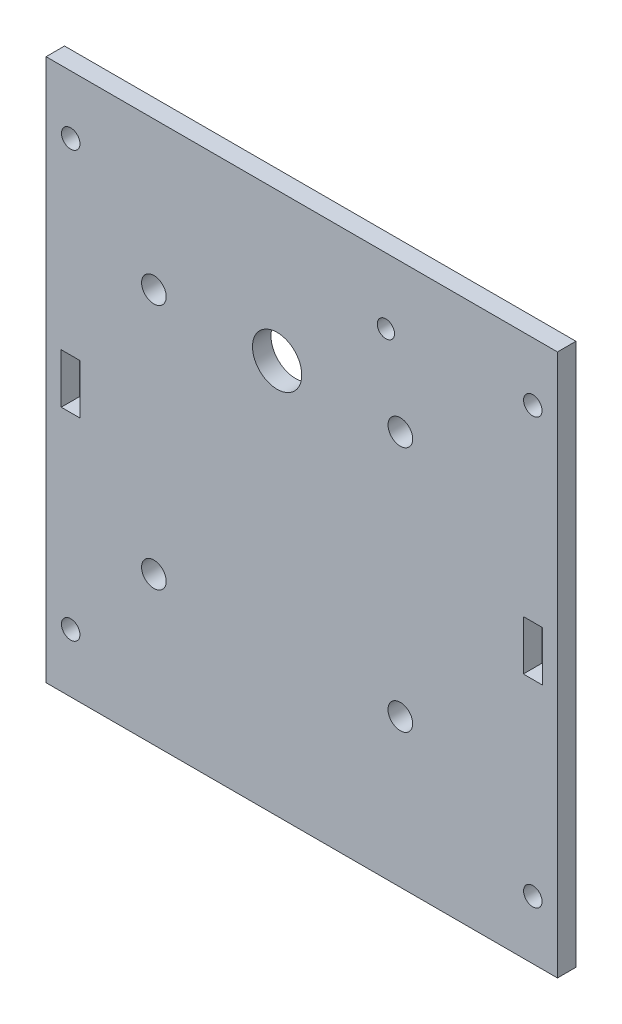
ISO-10303-21;
HEADER;
FILE_DESCRIPTION(('STEP AP214'),'2;1');
FILE_NAME('part.step','',(''),(''),'','','');
FILE_SCHEMA(('AUTOMOTIVE_DESIGN { 1 0 10303 214 1 1 1 1 }'));
ENDSEC;
DATA;
#1=APPLICATION_CONTEXT('core data for automotive mechanical design processes');
#2=APPLICATION_PROTOCOL_DEFINITION('international standard','automotive_design',2000,#1);
#3=PRODUCT_CONTEXT('',#1,'mechanical');
#4=PRODUCT('Part','Part','',(#3));
#5=PRODUCT_RELATED_PRODUCT_CATEGORY('part','',(#4));
#6=PRODUCT_DEFINITION_FORMATION('','',#4);
#7=PRODUCT_DEFINITION_CONTEXT('part definition',#1,'design');
#8=PRODUCT_DEFINITION('design','',#6,#7);
#9=PRODUCT_DEFINITION_SHAPE('','',#8);
#10=(LENGTH_UNIT() NAMED_UNIT(*) SI_UNIT(.MILLI.,.METRE.));
#11=(NAMED_UNIT(*) PLANE_ANGLE_UNIT() SI_UNIT($,.RADIAN.));
#12=(NAMED_UNIT(*) SI_UNIT($,.STERADIAN.) SOLID_ANGLE_UNIT());
#13=UNCERTAINTY_MEASURE_WITH_UNIT(LENGTH_MEASURE(1.E-05),#10,'distance_accuracy_value','');
#14=(GEOMETRIC_REPRESENTATION_CONTEXT(3) GLOBAL_UNCERTAINTY_ASSIGNED_CONTEXT((#13)) GLOBAL_UNIT_ASSIGNED_CONTEXT((#10,
#11,#12)) REPRESENTATION_CONTEXT('',''));
#15=CARTESIAN_POINT('',(0.,0.,0.));
#16=DIRECTION('',(0.,0.,1.));
#17=DIRECTION('',(1.,0.,0.));
#18=AXIS2_PLACEMENT_3D('',#15,#16,#17);
#19=CARTESIAN_POINT('',(0.,0.,3.));
#20=DIRECTION('',(0.,0.,1.));
#21=DIRECTION('',(1.,0.,0.));
#22=AXIS2_PLACEMENT_3D('',#19,#20,#21);
#23=PLANE('',#22);
#24=CARTESIAN_POINT('',(-5.65315315315312,7.11711711711726,3.));
#25=DIRECTION('',(0.,0.,1.));
#26=DIRECTION('',(1.,0.,0.));
#27=AXIS2_PLACEMENT_3D('',#24,#25,#26);
#28=CIRCLE('',#27,1.99999999999964);
#29=CARTESIAN_POINT('',(-3.65315315315347,7.11711711711726,3.));
#30=VERTEX_POINT('',#29);
#31=EDGE_CURVE('E185',#30,#30,#28,.T.);
#32=ORIENTED_EDGE('',*,*,#31,.F.);
#33=EDGE_LOOP('',(#32));
#34=FACE_BOUND('',#33,.T.);
#35=CARTESIAN_POINT('',(-45.6531531531531,-32.8828828828828,3.));
#36=DIRECTION('',(0.,0.,1.));
#37=DIRECTION('',(1.,0.,0.));
#38=AXIS2_PLACEMENT_3D('',#35,#36,#37);
#39=CIRCLE('',#38,2.00000000000004);
#40=CARTESIAN_POINT('',(-43.6531531531531,-32.8828828828828,3.));
#41=VERTEX_POINT('',#40);
#42=EDGE_CURVE('E201',#41,#41,#39,.T.);
#43=ORIENTED_EDGE('',*,*,#42,.F.);
#44=EDGE_LOOP('',(#43));
#45=FACE_BOUND('',#44,.T.);
#46=CARTESIAN_POINT('',(-5.65315315315312,-32.8828828828828,3.));
#47=DIRECTION('',(0.,0.,1.));
#48=DIRECTION('',(1.,0.,0.));
#49=AXIS2_PLACEMENT_3D('',#46,#47,#48);
#50=CIRCLE('',#49,1.99999999999992);
#51=CARTESIAN_POINT('',(-3.6531531531532,-32.8828828828828,3.));
#52=VERTEX_POINT('',#51);
#53=EDGE_CURVE('E217',#52,#52,#50,.T.);
#54=ORIENTED_EDGE('',*,*,#53,.F.);
#55=EDGE_LOOP('',(#54));
#56=FACE_BOUND('',#55,.T.);
#57=CARTESIAN_POINT('',(-59.1531531531532,-47.3828828828829,3.));
#58=DIRECTION('',(0.,0.,1.));
#59=DIRECTION('',(1.,0.,0.));
#60=AXIS2_PLACEMENT_3D('',#57,#58,#59);
#61=CIRCLE('',#60,1.5);
#62=CARTESIAN_POINT('',(-57.6531531531532,-47.3828828828829,3.));
#63=VERTEX_POINT('',#62);
#64=EDGE_CURVE('E233',#63,#63,#61,.T.);
#65=ORIENTED_EDGE('',*,*,#64,.F.);
#66=EDGE_LOOP('',(#65));
#67=FACE_BOUND('',#66,.T.);
#68=CARTESIAN_POINT('',(-59.1531531531532,21.6171171171171,3.));
#69=DIRECTION('',(0.,0.,1.));
#70=DIRECTION('',(1.,0.,0.));
#71=AXIS2_PLACEMENT_3D('',#68,#69,#70);
#72=CIRCLE('',#71,1.5);
#73=CARTESIAN_POINT('',(-57.6531531531532,21.6171171171171,3.));
#74=VERTEX_POINT('',#73);
#75=EDGE_CURVE('E249',#74,#74,#72,.T.);
#76=ORIENTED_EDGE('',*,*,#75,.F.);
#77=EDGE_LOOP('',(#76));
#78=FACE_BOUND('',#77,.T.);
#79=DIRECTION('',(-1.,0.,0.));
#80=VECTOR('',#79,1.);
#81=CARTESIAN_POINT('',(-63.1531531531532,31.1171171171171,3.));
#82=LINE('',#81,#80);
#83=CARTESIAN_POINT('',(19.8468468468468,31.1171171171171,3.));
#84=VERTEX_POINT('',#83);
#85=CARTESIAN_POINT('',(-63.1531531531532,31.1171171171171,3.));
#86=VERTEX_POINT('',#85);
#87=EDGE_CURVE('E300',#84,#86,#82,.T.);
#88=ORIENTED_EDGE('',*,*,#87,.T.);
#89=DIRECTION('',(0.,-1.,0.));
#90=VECTOR('',#89,1.);
#91=CARTESIAN_POINT('',(-63.1531531531532,31.1171171171171,3.));
#92=LINE('',#91,#90);
#93=CARTESIAN_POINT('',(-63.1531531531532,-56.8828828828829,3.));
#94=VERTEX_POINT('',#93);
#95=EDGE_CURVE('E304',#86,#94,#92,.T.);
#96=ORIENTED_EDGE('',*,*,#95,.T.);
#97=DIRECTION('',(1.,0.,0.));
#98=VECTOR('',#97,1.);
#99=CARTESIAN_POINT('',(19.8468468468468,-56.8828828828829,3.));
#100=LINE('',#99,#98);
#101=CARTESIAN_POINT('',(19.8468468468468,-56.8828828828829,3.));
#102=VERTEX_POINT('',#101);
#103=EDGE_CURVE('E308',#94,#102,#100,.T.);
#104=ORIENTED_EDGE('',*,*,#103,.T.);
#105=DIRECTION('',(0.,1.,0.));
#106=VECTOR('',#105,1.);
#107=CARTESIAN_POINT('',(19.8468468468468,-56.8828828828829,3.));
#108=LINE('',#107,#106);
#109=EDGE_CURVE('E311',#102,#84,#108,.T.);
#110=ORIENTED_EDGE('',*,*,#109,.T.);
#111=EDGE_LOOP('',(#88,#96,#104,#110));
#112=FACE_BOUND('',#111,.T.);
#113=DIRECTION('',(-1.,0.,0.));
#114=VECTOR('',#113,1.);
#115=CARTESIAN_POINT('',(-60.6931531531532,-8.84288288288288,3.));
#116=LINE('',#115,#114);
#117=CARTESIAN_POINT('',(-57.6131531531532,-8.84288288288288,3.));
#118=VERTEX_POINT('',#117);
#119=CARTESIAN_POINT('',(-60.6931531531532,-8.84288288288288,3.));
#120=VERTEX_POINT('',#119);
#121=EDGE_CURVE('E260',#118,#120,#116,.T.);
#122=ORIENTED_EDGE('',*,*,#121,.F.);
#123=DIRECTION('',(0.,1.,0.));
#124=VECTOR('',#123,1.);
#125=CARTESIAN_POINT('',(-57.6131531531532,-8.84288288288288,3.));
#126=LINE('',#125,#124);
#127=CARTESIAN_POINT('',(-57.6131531531532,-16.9228828828829,3.));
#128=VERTEX_POINT('',#127);
#129=EDGE_CURVE('E257',#128,#118,#126,.T.);
#130=ORIENTED_EDGE('',*,*,#129,.F.);
#131=DIRECTION('',(1.,0.,0.));
#132=VECTOR('',#131,1.);
#133=CARTESIAN_POINT('',(-60.6931531531532,-16.9228828828829,3.));
#134=LINE('',#133,#132);
#135=CARTESIAN_POINT('',(-60.6931531531532,-16.9228828828829,3.));
#136=VERTEX_POINT('',#135);
#137=EDGE_CURVE('E268',#136,#128,#134,.T.);
#138=ORIENTED_EDGE('',*,*,#137,.F.);
#139=DIRECTION('',(0.,-1.,0.));
#140=VECTOR('',#139,1.);
#141=CARTESIAN_POINT('',(-60.6931531531532,-8.84288288288288,3.));
#142=LINE('',#141,#140);
#143=EDGE_CURVE('E264',#120,#136,#142,.T.);
#144=ORIENTED_EDGE('',*,*,#143,.F.);
#145=EDGE_LOOP('',(#122,#130,#138,#144));
#146=FACE_BOUND('',#145,.T.);
#147=CARTESIAN_POINT('',(15.8468468468468,21.6171171171171,3.));
#148=DIRECTION('',(0.,0.,1.));
#149=DIRECTION('',(1.,0.,0.));
#150=AXIS2_PLACEMENT_3D('',#147,#148,#149);
#151=CIRCLE('',#150,1.5);
#152=CARTESIAN_POINT('',(17.3468468468468,21.6171171171171,3.));
#153=VERTEX_POINT('',#152);
#154=EDGE_CURVE('E241',#153,#153,#151,.T.);
#155=ORIENTED_EDGE('',*,*,#154,.F.);
#156=EDGE_LOOP('',(#155));
#157=FACE_BOUND('',#156,.T.);
#158=CARTESIAN_POINT('',(15.8468468468468,-47.3828828828829,3.));
#159=DIRECTION('',(0.,0.,1.));
#160=DIRECTION('',(1.,0.,0.));
#161=AXIS2_PLACEMENT_3D('',#158,#159,#160);
#162=CIRCLE('',#161,1.5);
#163=CARTESIAN_POINT('',(17.3468468468468,-47.3828828828829,3.));
#164=VERTEX_POINT('',#163);
#165=EDGE_CURVE('E225',#164,#164,#162,.T.);
#166=ORIENTED_EDGE('',*,*,#165,.F.);
#167=EDGE_LOOP('',(#166));
#168=FACE_BOUND('',#167,.T.);
#169=CARTESIAN_POINT('',(-25.653153153153,7.11711711711709,3.));
#170=DIRECTION('',(0.,0.,1.));
#171=DIRECTION('',(1.,0.,0.));
#172=AXIS2_PLACEMENT_3D('',#169,#170,#171);
#173=CIRCLE('',#172,4.);
#174=CARTESIAN_POINT('',(-21.653153153153,7.11711711711709,3.));
#175=VERTEX_POINT('',#174);
#176=EDGE_CURVE('E209',#175,#175,#173,.T.);
#177=ORIENTED_EDGE('',*,*,#176,.F.);
#178=EDGE_LOOP('',(#177));
#179=FACE_BOUND('',#178,.T.);
#180=CARTESIAN_POINT('',(-45.6531531531531,7.11711711711726,3.));
#181=DIRECTION('',(0.,0.,1.));
#182=DIRECTION('',(1.,0.,0.));
#183=AXIS2_PLACEMENT_3D('',#180,#181,#182);
#184=CIRCLE('',#183,1.99999999999992);
#185=CARTESIAN_POINT('',(-43.6531531531532,7.11711711711726,3.));
#186=VERTEX_POINT('',#185);
#187=EDGE_CURVE('E193',#186,#186,#184,.T.);
#188=ORIENTED_EDGE('',*,*,#187,.F.);
#189=EDGE_LOOP('',(#188));
#190=FACE_BOUND('',#189,.T.);
#191=CARTESIAN_POINT('',(-7.99836903628659,20.4417026680375,3.));
#192=DIRECTION('',(0.,0.,1.));
#193=DIRECTION('',(1.,0.,0.));
#194=AXIS2_PLACEMENT_3D('',#191,#192,#193);
#195=CIRCLE('',#194,1.40037475540282);
#196=CARTESIAN_POINT('',(-6.59799428088377,20.4417026680375,3.));
#197=VERTEX_POINT('',#196);
#198=EDGE_CURVE('E177',#197,#197,#195,.T.);
#199=ORIENTED_EDGE('',*,*,#198,.F.);
#200=EDGE_LOOP('',(#199));
#201=FACE_BOUND('',#200,.T.);
#202=DIRECTION('',(-1.,0.,0.));
#203=VECTOR('',#202,1.);
#204=CARTESIAN_POINT('',(14.3068468468468,-8.84288288288288,3.));
#205=LINE('',#204,#203);
#206=CARTESIAN_POINT('',(17.3868468468468,-8.84288288288288,3.));
#207=VERTEX_POINT('',#206);
#208=CARTESIAN_POINT('',(14.3068468468468,-8.84288288288288,3.));
#209=VERTEX_POINT('',#208);
#210=EDGE_CURVE('E138',#207,#209,#205,.T.);
#211=ORIENTED_EDGE('',*,*,#210,.F.);
#212=DIRECTION('',(0.,1.,0.));
#213=VECTOR('',#212,1.);
#214=CARTESIAN_POINT('',(17.3868468468468,-8.84288288288288,3.));
#215=LINE('',#214,#213);
#216=CARTESIAN_POINT('',(17.3868468468468,-16.9228828828829,3.));
#217=VERTEX_POINT('',#216);
#218=EDGE_CURVE('E129',#217,#207,#215,.T.);
#219=ORIENTED_EDGE('',*,*,#218,.F.);
#220=DIRECTION('',(1.,0.,0.));
#221=VECTOR('',#220,1.);
#222=CARTESIAN_POINT('',(14.3068468468468,-16.9228828828829,3.));
#223=LINE('',#222,#221);
#224=CARTESIAN_POINT('',(14.3068468468468,-16.9228828828829,3.));
#225=VERTEX_POINT('',#224);
#226=EDGE_CURVE('E155',#225,#217,#223,.T.);
#227=ORIENTED_EDGE('',*,*,#226,.F.);
#228=DIRECTION('',(0.,-1.,0.));
#229=VECTOR('',#228,1.);
#230=CARTESIAN_POINT('',(14.3068468468468,-8.84288288288288,3.));
#231=LINE('',#230,#229);
#232=EDGE_CURVE('E151',#209,#225,#231,.T.);
#233=ORIENTED_EDGE('',*,*,#232,.F.);
#234=EDGE_LOOP('',(#211,#219,#227,#233));
#235=FACE_BOUND('',#234,.T.);
#236=ADVANCED_FACE('F39',(#34,#45,#56,#67,#78,#112,#146,#157,#168,#179,#190,#201,#235),#23,.T.);
#237=CARTESIAN_POINT('',(0.,0.,0.));
#238=DIRECTION('',(0.,0.,1.));
#239=DIRECTION('',(1.,0.,0.));
#240=AXIS2_PLACEMENT_3D('',#237,#238,#239);
#241=PLANE('',#240);
#242=CARTESIAN_POINT('',(-7.99836903628659,20.4417026680375,0.));
#243=DIRECTION('',(0.,0.,1.));
#244=DIRECTION('',(1.,0.,0.));
#245=AXIS2_PLACEMENT_3D('',#242,#243,#244);
#246=CIRCLE('',#245,1.40037475540282);
#247=CARTESIAN_POINT('',(-6.59799428088377,20.4417026680375,0.));
#248=VERTEX_POINT('',#247);
#249=EDGE_CURVE('E147',#248,#248,#246,.T.);
#250=ORIENTED_EDGE('',*,*,#249,.T.);
#251=EDGE_LOOP('',(#250));
#252=FACE_BOUND('',#251,.T.);
#253=CARTESIAN_POINT('',(-5.65315315315312,7.11711711711726,0.));
#254=DIRECTION('',(0.,0.,1.));
#255=DIRECTION('',(1.,0.,0.));
#256=AXIS2_PLACEMENT_3D('',#253,#254,#255);
#257=CIRCLE('',#256,1.99999999999964);
#258=CARTESIAN_POINT('',(-3.65315315315347,7.11711711711726,0.));
#259=VERTEX_POINT('',#258);
#260=EDGE_CURVE('E181',#259,#259,#257,.T.);
#261=ORIENTED_EDGE('',*,*,#260,.T.);
#262=EDGE_LOOP('',(#261));
#263=FACE_BOUND('',#262,.T.);
#264=CARTESIAN_POINT('',(-45.6531531531531,7.11711711711726,0.));
#265=DIRECTION('',(0.,0.,1.));
#266=DIRECTION('',(1.,0.,0.));
#267=AXIS2_PLACEMENT_3D('',#264,#265,#266);
#268=CIRCLE('',#267,1.99999999999992);
#269=CARTESIAN_POINT('',(-43.6531531531532,7.11711711711726,0.));
#270=VERTEX_POINT('',#269);
#271=EDGE_CURVE('E189',#270,#270,#268,.T.);
#272=ORIENTED_EDGE('',*,*,#271,.T.);
#273=EDGE_LOOP('',(#272));
#274=FACE_BOUND('',#273,.T.);
#275=CARTESIAN_POINT('',(-45.6531531531531,-32.8828828828828,0.));
#276=DIRECTION('',(0.,0.,1.));
#277=DIRECTION('',(1.,0.,0.));
#278=AXIS2_PLACEMENT_3D('',#275,#276,#277);
#279=CIRCLE('',#278,2.00000000000004);
#280=CARTESIAN_POINT('',(-43.6531531531531,-32.8828828828828,0.));
#281=VERTEX_POINT('',#280);
#282=EDGE_CURVE('E197',#281,#281,#279,.T.);
#283=ORIENTED_EDGE('',*,*,#282,.T.);
#284=EDGE_LOOP('',(#283));
#285=FACE_BOUND('',#284,.T.);
#286=CARTESIAN_POINT('',(-25.653153153153,7.11711711711709,0.));
#287=DIRECTION('',(0.,0.,1.));
#288=DIRECTION('',(1.,0.,0.));
#289=AXIS2_PLACEMENT_3D('',#286,#287,#288);
#290=CIRCLE('',#289,4.);
#291=CARTESIAN_POINT('',(-21.653153153153,7.11711711711709,0.));
#292=VERTEX_POINT('',#291);
#293=EDGE_CURVE('E205',#292,#292,#290,.T.);
#294=ORIENTED_EDGE('',*,*,#293,.T.);
#295=EDGE_LOOP('',(#294));
#296=FACE_BOUND('',#295,.T.);
#297=CARTESIAN_POINT('',(-5.65315315315312,-32.8828828828828,0.));
#298=DIRECTION('',(0.,0.,1.));
#299=DIRECTION('',(1.,0.,0.));
#300=AXIS2_PLACEMENT_3D('',#297,#298,#299);
#301=CIRCLE('',#300,1.99999999999992);
#302=CARTESIAN_POINT('',(-3.6531531531532,-32.8828828828828,0.));
#303=VERTEX_POINT('',#302);
#304=EDGE_CURVE('E213',#303,#303,#301,.T.);
#305=ORIENTED_EDGE('',*,*,#304,.T.);
#306=EDGE_LOOP('',(#305));
#307=FACE_BOUND('',#306,.T.);
#308=CARTESIAN_POINT('',(15.8468468468468,-47.3828828828829,0.));
#309=DIRECTION('',(0.,0.,1.));
#310=DIRECTION('',(1.,0.,0.));
#311=AXIS2_PLACEMENT_3D('',#308,#309,#310);
#312=CIRCLE('',#311,1.5);
#313=CARTESIAN_POINT('',(17.3468468468468,-47.3828828828829,0.));
#314=VERTEX_POINT('',#313);
#315=EDGE_CURVE('E221',#314,#314,#312,.T.);
#316=ORIENTED_EDGE('',*,*,#315,.T.);
#317=EDGE_LOOP('',(#316));
#318=FACE_BOUND('',#317,.T.);
#319=CARTESIAN_POINT('',(-59.1531531531532,-47.3828828828829,0.));
#320=DIRECTION('',(0.,0.,1.));
#321=DIRECTION('',(1.,0.,0.));
#322=AXIS2_PLACEMENT_3D('',#319,#320,#321);
#323=CIRCLE('',#322,1.5);
#324=CARTESIAN_POINT('',(-57.6531531531532,-47.3828828828829,0.));
#325=VERTEX_POINT('',#324);
#326=EDGE_CURVE('E229',#325,#325,#323,.T.);
#327=ORIENTED_EDGE('',*,*,#326,.T.);
#328=EDGE_LOOP('',(#327));
#329=FACE_BOUND('',#328,.T.);
#330=CARTESIAN_POINT('',(15.8468468468468,21.6171171171171,0.));
#331=DIRECTION('',(0.,0.,1.));
#332=DIRECTION('',(1.,0.,0.));
#333=AXIS2_PLACEMENT_3D('',#330,#331,#332);
#334=CIRCLE('',#333,1.5);
#335=CARTESIAN_POINT('',(17.3468468468468,21.6171171171171,0.));
#336=VERTEX_POINT('',#335);
#337=EDGE_CURVE('E237',#336,#336,#334,.T.);
#338=ORIENTED_EDGE('',*,*,#337,.T.);
#339=EDGE_LOOP('',(#338));
#340=FACE_BOUND('',#339,.T.);
#341=CARTESIAN_POINT('',(-59.1531531531532,21.6171171171171,0.));
#342=DIRECTION('',(0.,0.,1.));
#343=DIRECTION('',(1.,0.,0.));
#344=AXIS2_PLACEMENT_3D('',#341,#342,#343);
#345=CIRCLE('',#344,1.5);
#346=CARTESIAN_POINT('',(-57.6531531531532,21.6171171171171,0.));
#347=VERTEX_POINT('',#346);
#348=EDGE_CURVE('E245',#347,#347,#345,.T.);
#349=ORIENTED_EDGE('',*,*,#348,.T.);
#350=EDGE_LOOP('',(#349));
#351=FACE_BOUND('',#350,.T.);
#352=DIRECTION('',(0.,1.,0.));
#353=VECTOR('',#352,1.);
#354=CARTESIAN_POINT('',(-57.6131531531532,-8.84288288288288,0.));
#355=LINE('',#354,#353);
#356=CARTESIAN_POINT('',(-57.6131531531532,-16.9228828828829,0.));
#357=VERTEX_POINT('',#356);
#358=CARTESIAN_POINT('',(-57.6131531531532,-8.84288288288288,0.));
#359=VERTEX_POINT('',#358);
#360=EDGE_CURVE('E253',#357,#359,#355,.T.);
#361=ORIENTED_EDGE('',*,*,#360,.T.);
#362=DIRECTION('',(-1.,0.,0.));
#363=VECTOR('',#362,1.);
#364=CARTESIAN_POINT('',(-60.6931531531532,-8.84288288288288,0.));
#365=LINE('',#364,#363);
#366=CARTESIAN_POINT('',(-60.6931531531532,-8.84288288288288,0.));
#367=VERTEX_POINT('',#366);
#368=EDGE_CURVE('E275',#359,#367,#365,.T.);
#369=ORIENTED_EDGE('',*,*,#368,.T.);
#370=DIRECTION('',(0.,-1.,0.));
#371=VECTOR('',#370,1.);
#372=CARTESIAN_POINT('',(-60.6931531531532,-8.84288288288288,0.));
#373=LINE('',#372,#371);
#374=CARTESIAN_POINT('',(-60.6931531531532,-16.9228828828829,0.));
#375=VERTEX_POINT('',#374);
#376=EDGE_CURVE('E279',#367,#375,#373,.T.);
#377=ORIENTED_EDGE('',*,*,#376,.T.);
#378=DIRECTION('',(1.,0.,0.));
#379=VECTOR('',#378,1.);
#380=CARTESIAN_POINT('',(-60.6931531531532,-16.9228828828829,0.));
#381=LINE('',#380,#379);
#382=EDGE_CURVE('E261',#375,#357,#381,.T.);
#383=ORIENTED_EDGE('',*,*,#382,.T.);
#384=EDGE_LOOP('',(#361,#369,#377,#383));
#385=FACE_BOUND('',#384,.T.);
#386=DIRECTION('',(-1.,0.,0.));
#387=VECTOR('',#386,1.);
#388=CARTESIAN_POINT('',(-63.1531531531532,31.1171171171171,0.));
#389=LINE('',#388,#387);
#390=CARTESIAN_POINT('',(19.8468468468468,31.1171171171171,0.));
#391=VERTEX_POINT('',#390);
#392=CARTESIAN_POINT('',(-63.1531531531532,31.1171171171171,0.));
#393=VERTEX_POINT('',#392);
#394=EDGE_CURVE('E299',#391,#393,#389,.T.);
#395=ORIENTED_EDGE('',*,*,#394,.F.);
#396=DIRECTION('',(0.,1.,0.));
#397=VECTOR('',#396,1.);
#398=CARTESIAN_POINT('',(19.8468468468468,-56.8828828828829,0.));
#399=LINE('',#398,#397);
#400=CARTESIAN_POINT('',(19.8468468468468,-56.8828828828829,0.));
#401=VERTEX_POINT('',#400);
#402=EDGE_CURVE('E305',#401,#391,#399,.T.);
#403=ORIENTED_EDGE('',*,*,#402,.F.);
#404=DIRECTION('',(1.,0.,0.));
#405=VECTOR('',#404,1.);
#406=CARTESIAN_POINT('',(19.8468468468468,-56.8828828828829,0.));
#407=LINE('',#406,#405);
#408=CARTESIAN_POINT('',(-63.1531531531532,-56.8828828828829,0.));
#409=VERTEX_POINT('',#408);
#410=EDGE_CURVE('E321',#409,#401,#407,.T.);
#411=ORIENTED_EDGE('',*,*,#410,.F.);
#412=DIRECTION('',(0.,-1.,0.));
#413=VECTOR('',#412,1.);
#414=CARTESIAN_POINT('',(-63.1531531531532,31.1171171171171,0.));
#415=LINE('',#414,#413);
#416=EDGE_CURVE('E318',#393,#409,#415,.T.);
#417=ORIENTED_EDGE('',*,*,#416,.F.);
#418=EDGE_LOOP('',(#395,#403,#411,#417));
#419=FACE_BOUND('',#418,.T.);
#420=DIRECTION('',(0.,1.,0.));
#421=VECTOR('',#420,1.);
#422=CARTESIAN_POINT('',(17.3868468468468,-8.84288288288288,0.));
#423=LINE('',#422,#421);
#424=CARTESIAN_POINT('',(17.3868468468468,-16.9228828828829,0.));
#425=VERTEX_POINT('',#424);
#426=CARTESIAN_POINT('',(17.3868468468468,-8.84288288288288,0.));
#427=VERTEX_POINT('',#426);
#428=EDGE_CURVE('E63',#425,#427,#423,.T.);
#429=ORIENTED_EDGE('',*,*,#428,.T.);
#430=DIRECTION('',(-1.,0.,0.));
#431=VECTOR('',#430,1.);
#432=CARTESIAN_POINT('',(14.3068468468468,-8.84288288288288,0.));
#433=LINE('',#432,#431);
#434=CARTESIAN_POINT('',(14.3068468468468,-8.84288288288288,0.));
#435=VERTEX_POINT('',#434);
#436=EDGE_CURVE('E145',#427,#435,#433,.T.);
#437=ORIENTED_EDGE('',*,*,#436,.T.);
#438=DIRECTION('',(0.,-1.,0.));
#439=VECTOR('',#438,1.);
#440=CARTESIAN_POINT('',(14.3068468468468,-8.84288288288288,0.));
#441=LINE('',#440,#439);
#442=CARTESIAN_POINT('',(14.3068468468468,-16.9228828828829,0.));
#443=VERTEX_POINT('',#442);
#444=EDGE_CURVE('E164',#435,#443,#441,.T.);
#445=ORIENTED_EDGE('',*,*,#444,.T.);
#446=DIRECTION('',(1.,0.,0.));
#447=VECTOR('',#446,1.);
#448=CARTESIAN_POINT('',(14.3068468468468,-16.9228828828829,0.));
#449=LINE('',#448,#447);
#450=EDGE_CURVE('E139',#443,#425,#449,.T.);
#451=ORIENTED_EDGE('',*,*,#450,.T.);
#452=EDGE_LOOP('',(#429,#437,#445,#451));
#453=FACE_BOUND('',#452,.T.);
#454=ADVANCED_FACE('F344',(#252,#263,#274,#285,#296,#307,#318,#329,#340,#351,#385,#419,#453),
#241,.F.);
#455=CARTESIAN_POINT('',(-63.1531531531532,31.1171171171171,3.));
#456=DIRECTION('',(0.,-1.,0.));
#457=DIRECTION('',(0.,0.,-1.));
#458=AXIS2_PLACEMENT_3D('',#455,#456,#457);
#459=PLANE('',#458);
#460=ORIENTED_EDGE('',*,*,#394,.T.);
#461=DIRECTION('',(0.,0.,-1.));
#462=VECTOR('',#461,1.);
#463=CARTESIAN_POINT('',(-63.1531531531532,31.1171171171171,3.));
#464=LINE('',#463,#462);
#465=EDGE_CURVE('E11',#86,#393,#464,.T.);
#466=ORIENTED_EDGE('',*,*,#465,.F.);
#467=ORIENTED_EDGE('',*,*,#87,.F.);
#468=DIRECTION('',(0.,0.,-1.));
#469=VECTOR('',#468,1.);
#470=CARTESIAN_POINT('',(19.8468468468468,31.1171171171171,3.));
#471=LINE('',#470,#469);
#472=EDGE_CURVE('E314',#84,#391,#471,.T.);
#473=ORIENTED_EDGE('',*,*,#472,.T.);
#474=EDGE_LOOP('',(#460,#466,#467,#473));
#475=FACE_BOUND('',#474,.T.);
#476=ADVANCED_FACE('F41',(#475),#459,.F.);
#477=CARTESIAN_POINT('',(-63.1531531531532,31.1171171171171,3.));
#478=DIRECTION('',(1.,0.,0.));
#479=DIRECTION('',(0.,0.,-1.));
#480=AXIS2_PLACEMENT_3D('',#477,#478,#479);
#481=PLANE('',#480);
#482=ORIENTED_EDGE('',*,*,#416,.T.);
#483=DIRECTION('',(0.,0.,-1.));
#484=VECTOR('',#483,1.);
#485=CARTESIAN_POINT('',(-63.1531531531532,-56.8828828828829,3.));
#486=LINE('',#485,#484);
#487=EDGE_CURVE('E48',#94,#409,#486,.T.);
#488=ORIENTED_EDGE('',*,*,#487,.F.);
#489=ORIENTED_EDGE('',*,*,#95,.F.);
#490=ORIENTED_EDGE('',*,*,#465,.T.);
#491=EDGE_LOOP('',(#482,#488,#489,#490));
#492=FACE_BOUND('',#491,.T.);
#493=ADVANCED_FACE('F355',(#492),#481,.F.);
#494=CARTESIAN_POINT('',(19.8468468468468,-56.8828828828829,3.));
#495=DIRECTION('',(0.,1.,0.));
#496=DIRECTION('',(0.,0.,1.));
#497=AXIS2_PLACEMENT_3D('',#494,#495,#496);
#498=PLANE('',#497);
#499=ORIENTED_EDGE('',*,*,#410,.T.);
#500=DIRECTION('',(0.,0.,-1.));
#501=VECTOR('',#500,1.);
#502=CARTESIAN_POINT('',(19.8468468468468,-56.8828828828829,3.));
#503=LINE('',#502,#501);
#504=EDGE_CURVE('E329',#102,#401,#503,.T.);
#505=ORIENTED_EDGE('',*,*,#504,.F.);
#506=ORIENTED_EDGE('',*,*,#103,.F.);
#507=ORIENTED_EDGE('',*,*,#487,.T.);
#508=EDGE_LOOP('',(#499,#505,#506,#507));
#509=FACE_BOUND('',#508,.T.);
#510=ADVANCED_FACE('F338',(#509),#498,.F.);
#511=CARTESIAN_POINT('',(19.8468468468468,-56.8828828828829,3.));
#512=DIRECTION('',(-1.,0.,0.));
#513=DIRECTION('',(0.,0.,1.));
#514=AXIS2_PLACEMENT_3D('',#511,#512,#513);
#515=PLANE('',#514);
#516=ORIENTED_EDGE('',*,*,#402,.T.);
#517=ORIENTED_EDGE('',*,*,#472,.F.);
#518=ORIENTED_EDGE('',*,*,#109,.F.);
#519=ORIENTED_EDGE('',*,*,#504,.T.);
#520=EDGE_LOOP('',(#516,#517,#518,#519));
#521=FACE_BOUND('',#520,.T.);
#522=ADVANCED_FACE('F348',(#521),#515,.F.);
#523=CARTESIAN_POINT('',(-57.6131531531532,-8.84288288288288,3.));
#524=DIRECTION('',(-1.,0.,0.));
#525=DIRECTION('',(0.,0.,1.));
#526=AXIS2_PLACEMENT_3D('',#523,#524,#525);
#527=PLANE('',#526);
#528=ORIENTED_EDGE('',*,*,#360,.F.);
#529=DIRECTION('',(0.,0.,-1.));
#530=VECTOR('',#529,1.);
#531=CARTESIAN_POINT('',(-57.6131531531532,-16.9228828828829,3.));
#532=LINE('',#531,#530);
#533=EDGE_CURVE('E271',#128,#357,#532,.T.);
#534=ORIENTED_EDGE('',*,*,#533,.F.);
#535=ORIENTED_EDGE('',*,*,#129,.T.);
#536=DIRECTION('',(0.,0.,-1.));
#537=VECTOR('',#536,1.);
#538=CARTESIAN_POINT('',(-57.6131531531532,-8.84288288288288,3.));
#539=LINE('',#538,#537);
#540=EDGE_CURVE('E295',#118,#359,#539,.T.);
#541=ORIENTED_EDGE('',*,*,#540,.T.);
#542=EDGE_LOOP('',(#528,#534,#535,#541));
#543=FACE_BOUND('',#542,.T.);
#544=ADVANCED_FACE('F373',(#543),#527,.T.);
#545=CARTESIAN_POINT('',(-60.6931531531532,-8.84288288288288,3.));
#546=DIRECTION('',(0.,-1.,0.));
#547=DIRECTION('',(0.,0.,-1.));
#548=AXIS2_PLACEMENT_3D('',#545,#546,#547);
#549=PLANE('',#548);
#550=ORIENTED_EDGE('',*,*,#368,.F.);
#551=ORIENTED_EDGE('',*,*,#540,.F.);
#552=ORIENTED_EDGE('',*,*,#121,.T.);
#553=DIRECTION('',(0.,0.,-1.));
#554=VECTOR('',#553,1.);
#555=CARTESIAN_POINT('',(-60.6931531531532,-8.84288288288288,3.));
#556=LINE('',#555,#554);
#557=EDGE_CURVE('E292',#120,#367,#556,.T.);
#558=ORIENTED_EDGE('',*,*,#557,.T.);
#559=EDGE_LOOP('',(#550,#551,#552,#558));
#560=FACE_BOUND('',#559,.T.);
#561=ADVANCED_FACE('F380',(#560),#549,.T.);
#562=CARTESIAN_POINT('',(-60.6931531531532,-8.84288288288288,3.));
#563=DIRECTION('',(1.,0.,0.));
#564=DIRECTION('',(0.,0.,-1.));
#565=AXIS2_PLACEMENT_3D('',#562,#563,#564);
#566=PLANE('',#565);
#567=ORIENTED_EDGE('',*,*,#376,.F.);
#568=ORIENTED_EDGE('',*,*,#557,.F.);
#569=ORIENTED_EDGE('',*,*,#143,.T.);
#570=DIRECTION('',(0.,0.,-1.));
#571=VECTOR('',#570,1.);
#572=CARTESIAN_POINT('',(-60.6931531531532,-16.9228828828829,3.));
#573=LINE('',#572,#571);
#574=EDGE_CURVE('E289',#136,#375,#573,.T.);
#575=ORIENTED_EDGE('',*,*,#574,.T.);
#576=EDGE_LOOP('',(#567,#568,#569,#575));
#577=FACE_BOUND('',#576,.T.);
#578=ADVANCED_FACE('F385',(#577),#566,.T.);
#579=CARTESIAN_POINT('',(-60.6931531531532,-16.9228828828829,3.));
#580=DIRECTION('',(0.,1.,0.));
#581=DIRECTION('',(0.,0.,1.));
#582=AXIS2_PLACEMENT_3D('',#579,#580,#581);
#583=PLANE('',#582);
#584=ORIENTED_EDGE('',*,*,#382,.F.);
#585=ORIENTED_EDGE('',*,*,#574,.F.);
#586=ORIENTED_EDGE('',*,*,#137,.T.);
#587=ORIENTED_EDGE('',*,*,#533,.T.);
#588=EDGE_LOOP('',(#584,#585,#586,#587));
#589=FACE_BOUND('',#588,.T.);
#590=ADVANCED_FACE('F393',(#589),#583,.T.);
#591=CARTESIAN_POINT('',(-59.1531531531532,21.6171171171171,3.));
#592=DIRECTION('',(0.,0.,-1.));
#593=DIRECTION('',(-1.,0.,0.));
#594=AXIS2_PLACEMENT_3D('',#591,#592,#593);
#595=CYLINDRICAL_SURFACE('',#594,1.5);
#596=ORIENTED_EDGE('',*,*,#75,.T.);
#597=EDGE_LOOP('',(#596));
#598=FACE_BOUND('',#597,.T.);
#599=ORIENTED_EDGE('',*,*,#348,.F.);
#600=EDGE_LOOP('',(#599));
#601=FACE_BOUND('',#600,.T.);
#602=ADVANCED_FACE('F436',(#598,#601),#595,.F.);
#603=CARTESIAN_POINT('',(15.8468468468468,21.6171171171171,3.));
#604=DIRECTION('',(0.,0.,-1.));
#605=DIRECTION('',(-1.,0.,0.));
#606=AXIS2_PLACEMENT_3D('',#603,#604,#605);
#607=CYLINDRICAL_SURFACE('',#606,1.5);
#608=ORIENTED_EDGE('',*,*,#154,.T.);
#609=EDGE_LOOP('',(#608));
#610=FACE_BOUND('',#609,.T.);
#611=ORIENTED_EDGE('',*,*,#337,.F.);
#612=EDGE_LOOP('',(#611));
#613=FACE_BOUND('',#612,.T.);
#614=ADVANCED_FACE('F438',(#610,#613),#607,.F.);
#615=CARTESIAN_POINT('',(-59.1531531531532,-47.3828828828829,3.));
#616=DIRECTION('',(0.,0.,-1.));
#617=DIRECTION('',(-1.,0.,0.));
#618=AXIS2_PLACEMENT_3D('',#615,#616,#617);
#619=CYLINDRICAL_SURFACE('',#618,1.5);
#620=ORIENTED_EDGE('',*,*,#64,.T.);
#621=EDGE_LOOP('',(#620));
#622=FACE_BOUND('',#621,.T.);
#623=ORIENTED_EDGE('',*,*,#326,.F.);
#624=EDGE_LOOP('',(#623));
#625=FACE_BOUND('',#624,.T.);
#626=ADVANCED_FACE('F445',(#622,#625),#619,.F.);
#627=CARTESIAN_POINT('',(15.8468468468468,-47.3828828828829,3.));
#628=DIRECTION('',(0.,0.,-1.));
#629=DIRECTION('',(-1.,0.,0.));
#630=AXIS2_PLACEMENT_3D('',#627,#628,#629);
#631=CYLINDRICAL_SURFACE('',#630,1.5);
#632=ORIENTED_EDGE('',*,*,#165,.T.);
#633=EDGE_LOOP('',(#632));
#634=FACE_BOUND('',#633,.T.);
#635=ORIENTED_EDGE('',*,*,#315,.F.);
#636=EDGE_LOOP('',(#635));
#637=FACE_BOUND('',#636,.T.);
#638=ADVANCED_FACE('F479',(#634,#637),#631,.F.);
#639=CARTESIAN_POINT('',(-5.65315315315312,-32.8828828828828,3.));
#640=DIRECTION('',(0.,0.,-1.));
#641=DIRECTION('',(-1.,0.,0.));
#642=AXIS2_PLACEMENT_3D('',#639,#640,#641);
#643=CYLINDRICAL_SURFACE('',#642,1.99999999999992);
#644=ORIENTED_EDGE('',*,*,#53,.T.);
#645=EDGE_LOOP('',(#644));
#646=FACE_BOUND('',#645,.T.);
#647=ORIENTED_EDGE('',*,*,#304,.F.);
#648=EDGE_LOOP('',(#647));
#649=FACE_BOUND('',#648,.T.);
#650=ADVANCED_FACE('F488',(#646,#649),#643,.F.);
#651=CARTESIAN_POINT('',(-25.653153153153,7.11711711711709,3.));
#652=DIRECTION('',(0.,0.,-1.));
#653=DIRECTION('',(-1.,0.,0.));
#654=AXIS2_PLACEMENT_3D('',#651,#652,#653);
#655=CYLINDRICAL_SURFACE('',#654,4.);
#656=ORIENTED_EDGE('',*,*,#176,.T.);
#657=EDGE_LOOP('',(#656));
#658=FACE_BOUND('',#657,.T.);
#659=ORIENTED_EDGE('',*,*,#293,.F.);
#660=EDGE_LOOP('',(#659));
#661=FACE_BOUND('',#660,.T.);
#662=ADVANCED_FACE('F498',(#658,#661),#655,.F.);
#663=CARTESIAN_POINT('',(-45.6531531531531,-32.8828828828828,3.));
#664=DIRECTION('',(0.,0.,-1.));
#665=DIRECTION('',(-1.,0.,0.));
#666=AXIS2_PLACEMENT_3D('',#663,#664,#665);
#667=CYLINDRICAL_SURFACE('',#666,2.00000000000004);
#668=ORIENTED_EDGE('',*,*,#42,.T.);
#669=EDGE_LOOP('',(#668));
#670=FACE_BOUND('',#669,.T.);
#671=ORIENTED_EDGE('',*,*,#282,.F.);
#672=EDGE_LOOP('',(#671));
#673=FACE_BOUND('',#672,.T.);
#674=ADVANCED_FACE('F508',(#670,#673),#667,.F.);
#675=CARTESIAN_POINT('',(-45.6531531531531,7.11711711711726,3.));
#676=DIRECTION('',(0.,0.,-1.));
#677=DIRECTION('',(-1.,0.,0.));
#678=AXIS2_PLACEMENT_3D('',#675,#676,#677);
#679=CYLINDRICAL_SURFACE('',#678,1.99999999999992);
#680=ORIENTED_EDGE('',*,*,#187,.T.);
#681=EDGE_LOOP('',(#680));
#682=FACE_BOUND('',#681,.T.);
#683=ORIENTED_EDGE('',*,*,#271,.F.);
#684=EDGE_LOOP('',(#683));
#685=FACE_BOUND('',#684,.T.);
#686=ADVANCED_FACE('F518',(#682,#685),#679,.F.);
#687=CARTESIAN_POINT('',(-5.65315315315312,7.11711711711726,3.));
#688=DIRECTION('',(0.,0.,-1.));
#689=DIRECTION('',(-1.,0.,0.));
#690=AXIS2_PLACEMENT_3D('',#687,#688,#689);
#691=CYLINDRICAL_SURFACE('',#690,1.99999999999964);
#692=ORIENTED_EDGE('',*,*,#31,.T.);
#693=EDGE_LOOP('',(#692));
#694=FACE_BOUND('',#693,.T.);
#695=ORIENTED_EDGE('',*,*,#260,.F.);
#696=EDGE_LOOP('',(#695));
#697=FACE_BOUND('',#696,.T.);
#698=ADVANCED_FACE('F414',(#694,#697),#691,.F.);
#699=CARTESIAN_POINT('',(-7.99836903628659,20.4417026680375,3.));
#700=DIRECTION('',(0.,0.,-1.));
#701=DIRECTION('',(-1.,0.,0.));
#702=AXIS2_PLACEMENT_3D('',#699,#700,#701);
#703=CYLINDRICAL_SURFACE('',#702,1.40037475540282);
#704=ORIENTED_EDGE('',*,*,#198,.T.);
#705=EDGE_LOOP('',(#704));
#706=FACE_BOUND('',#705,.T.);
#707=ORIENTED_EDGE('',*,*,#249,.F.);
#708=EDGE_LOOP('',(#707));
#709=FACE_BOUND('',#708,.T.);
#710=ADVANCED_FACE('F411',(#706,#709),#703,.F.);
#711=CARTESIAN_POINT('',(17.3868468468468,-8.84288288288288,3.));
#712=DIRECTION('',(-1.,0.,0.));
#713=DIRECTION('',(0.,0.,1.));
#714=AXIS2_PLACEMENT_3D('',#711,#712,#713);
#715=PLANE('',#714);
#716=ORIENTED_EDGE('',*,*,#428,.F.);
#717=DIRECTION('',(0.,0.,-1.));
#718=VECTOR('',#717,1.);
#719=CARTESIAN_POINT('',(17.3868468468468,-16.9228828828829,3.));
#720=LINE('',#719,#718);
#721=EDGE_CURVE('E133',#217,#425,#720,.T.);
#722=ORIENTED_EDGE('',*,*,#721,.F.);
#723=ORIENTED_EDGE('',*,*,#218,.T.);
#724=DIRECTION('',(0.,0.,-1.));
#725=VECTOR('',#724,1.);
#726=CARTESIAN_POINT('',(17.3868468468468,-8.84288288288288,3.));
#727=LINE('',#726,#725);
#728=EDGE_CURVE('E132',#207,#427,#727,.T.);
#729=ORIENTED_EDGE('',*,*,#728,.T.);
#730=EDGE_LOOP('',(#716,#722,#723,#729));
#731=FACE_BOUND('',#730,.T.);
#732=ADVANCED_FACE('F131',(#731),#715,.T.);
#733=CARTESIAN_POINT('',(14.3068468468468,-8.84288288288288,3.));
#734=DIRECTION('',(0.,-1.,0.));
#735=DIRECTION('',(0.,0.,-1.));
#736=AXIS2_PLACEMENT_3D('',#733,#734,#735);
#737=PLANE('',#736);
#738=ORIENTED_EDGE('',*,*,#436,.F.);
#739=ORIENTED_EDGE('',*,*,#728,.F.);
#740=ORIENTED_EDGE('',*,*,#210,.T.);
#741=DIRECTION('',(0.,0.,-1.));
#742=VECTOR('',#741,1.);
#743=CARTESIAN_POINT('',(14.3068468468468,-8.84288288288288,3.));
#744=LINE('',#743,#742);
#745=EDGE_CURVE('E148',#209,#435,#744,.T.);
#746=ORIENTED_EDGE('',*,*,#745,.T.);
#747=EDGE_LOOP('',(#738,#739,#740,#746));
#748=FACE_BOUND('',#747,.T.);
#749=ADVANCED_FACE('F142',(#748),#737,.T.);
#750=CARTESIAN_POINT('',(14.3068468468468,-8.84288288288288,3.));
#751=DIRECTION('',(1.,0.,0.));
#752=DIRECTION('',(0.,1.,0.));
#753=AXIS2_PLACEMENT_3D('',#750,#751,#752);
#754=PLANE('',#753);
#755=ORIENTED_EDGE('',*,*,#444,.F.);
#756=ORIENTED_EDGE('',*,*,#745,.F.);
#757=ORIENTED_EDGE('',*,*,#232,.T.);
#758=DIRECTION('',(0.,0.,-1.));
#759=VECTOR('',#758,1.);
#760=CARTESIAN_POINT('',(14.3068468468468,-16.9228828828829,3.));
#761=LINE('',#760,#759);
#762=EDGE_CURVE('E55',#225,#443,#761,.T.);
#763=ORIENTED_EDGE('',*,*,#762,.T.);
#764=EDGE_LOOP('',(#755,#756,#757,#763));
#765=FACE_BOUND('',#764,.T.);
#766=ADVANCED_FACE('F560',(#765),#754,.T.);
#767=CARTESIAN_POINT('',(14.3068468468468,-16.9228828828829,3.));
#768=DIRECTION('',(0.,1.,0.));
#769=DIRECTION('',(0.,0.,1.));
#770=AXIS2_PLACEMENT_3D('',#767,#768,#769);
#771=PLANE('',#770);
#772=ORIENTED_EDGE('',*,*,#450,.F.);
#773=ORIENTED_EDGE('',*,*,#762,.F.);
#774=ORIENTED_EDGE('',*,*,#226,.T.);
#775=ORIENTED_EDGE('',*,*,#721,.T.);
#776=EDGE_LOOP('',(#772,#773,#774,#775));
#777=FACE_BOUND('',#776,.T.);
#778=ADVANCED_FACE('F569',(#777),#771,.T.);
#779=CLOSED_SHELL('',(#236,#454,#476,#493,#510,#522,#544,#561,#578,#590,#602,#614,#626,#638,
#650,#662,#674,#686,#698,#710,#732,#749,#766,#778));
#780=MANIFOLD_SOLID_BREP('B2',#779);
#781=ADVANCED_BREP_SHAPE_REPRESENTATION('',(#18,#780),#14);
#782=SHAPE_DEFINITION_REPRESENTATION(#9,#781);
ENDSEC;
END-ISO-10303-21;
